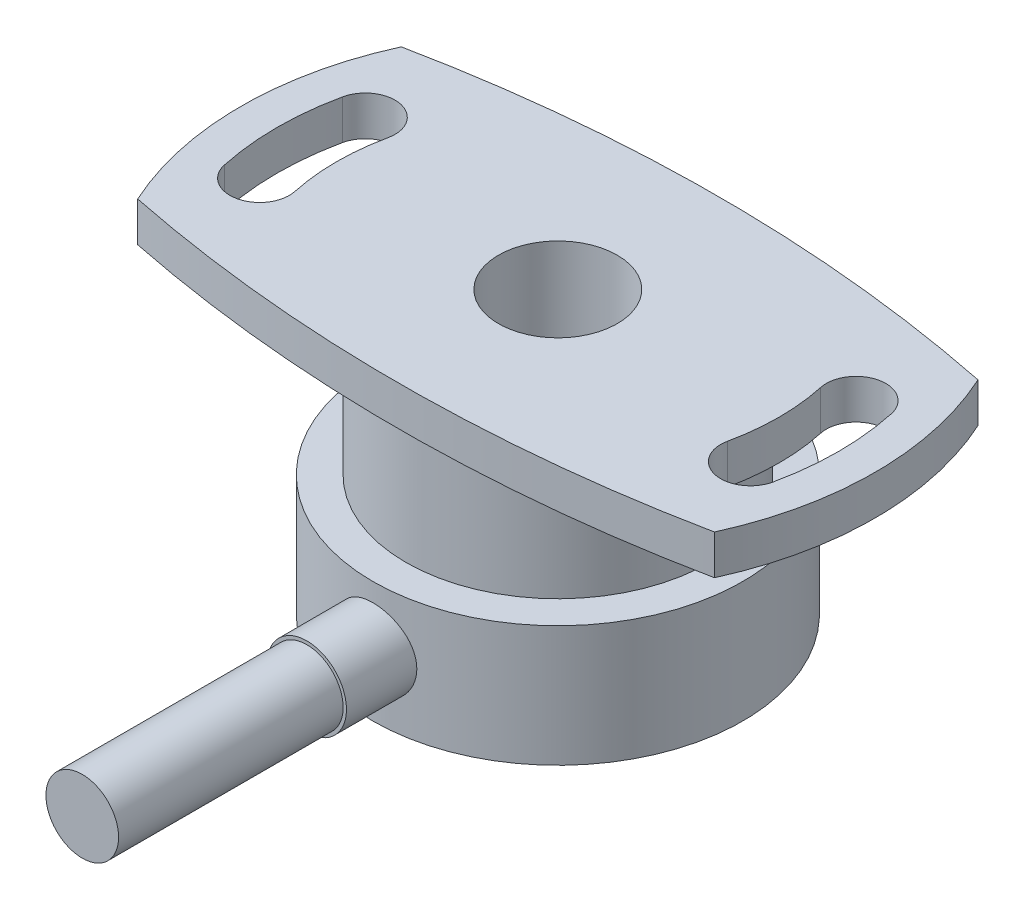
ISO-10303-21;
HEADER;
FILE_DESCRIPTION(('STEP AP214'),'2;1');
FILE_NAME('part.step','',(''),(''),'','','');
FILE_SCHEMA(('AUTOMOTIVE_DESIGN { 1 0 10303 214 1 1 1 1 }'));
ENDSEC;
DATA;
#1=APPLICATION_CONTEXT('core data for automotive mechanical design processes');
#2=APPLICATION_PROTOCOL_DEFINITION('international standard','automotive_design',2000,#1);
#3=PRODUCT_CONTEXT('',#1,'mechanical');
#4=PRODUCT('Part','Part','',(#3));
#5=PRODUCT_RELATED_PRODUCT_CATEGORY('part','',(#4));
#6=PRODUCT_DEFINITION_FORMATION('','',#4);
#7=PRODUCT_DEFINITION_CONTEXT('part definition',#1,'design');
#8=PRODUCT_DEFINITION('design','',#6,#7);
#9=PRODUCT_DEFINITION_SHAPE('','',#8);
#10=(LENGTH_UNIT() NAMED_UNIT(*) SI_UNIT(.MILLI.,.METRE.));
#11=(NAMED_UNIT(*) PLANE_ANGLE_UNIT() SI_UNIT($,.RADIAN.));
#12=(NAMED_UNIT(*) SI_UNIT($,.STERADIAN.) SOLID_ANGLE_UNIT());
#13=UNCERTAINTY_MEASURE_WITH_UNIT(LENGTH_MEASURE(1.E-05),#10,'distance_accuracy_value','');
#14=(GEOMETRIC_REPRESENTATION_CONTEXT(3) GLOBAL_UNCERTAINTY_ASSIGNED_CONTEXT((#13)) GLOBAL_UNIT_ASSIGNED_CONTEXT((#10,
#11,#12)) REPRESENTATION_CONTEXT('',''));
#15=CARTESIAN_POINT('',(0.,0.,0.));
#16=DIRECTION('',(0.,0.,1.));
#17=DIRECTION('',(1.,0.,0.));
#18=AXIS2_PLACEMENT_3D('',#15,#16,#17);
#19=CARTESIAN_POINT('',(0.,9.15,0.));
#20=DIRECTION('',(0.,-1.,0.));
#21=DIRECTION('',(0.,0.,-1.));
#22=AXIS2_PLACEMENT_3D('',#19,#20,#21);
#23=CYLINDRICAL_SURFACE('',#22,14.);
#24=CARTESIAN_POINT('',(0.,9.15,0.));
#25=DIRECTION('',(0.,1.,0.));
#26=DIRECTION('',(0.,0.,1.));
#27=AXIS2_PLACEMENT_3D('',#24,#25,#26);
#28=CIRCLE('',#27,14.);
#29=CARTESIAN_POINT('',(0.,9.15,14.));
#30=VERTEX_POINT('',#29);
#31=EDGE_CURVE('E255',#30,#30,#28,.T.);
#32=ORIENTED_EDGE('',*,*,#31,.F.);
#33=EDGE_LOOP('',(#32));
#34=FACE_BOUND('',#33,.T.);
#35=CARTESIAN_POINT('',(0.,0.,0.));
#36=DIRECTION('',(0.,1.,0.));
#37=DIRECTION('',(0.,0.,1.));
#38=AXIS2_PLACEMENT_3D('',#35,#36,#37);
#39=CIRCLE('',#38,14.);
#40=CARTESIAN_POINT('',(0.,0.,14.));
#41=VERTEX_POINT('',#40);
#42=EDGE_CURVE('E249',#41,#41,#39,.T.);
#43=ORIENTED_EDGE('',*,*,#42,.T.);
#44=EDGE_LOOP('',(#43));
#45=FACE_BOUND('',#44,.T.);
#46=CARTESIAN_POINT('',(-3.,4.7624839188906,13.6747943311773));
#47=CARTESIAN_POINT('',(-2.99999416477353,4.59606161392458,13.6747976912119));
#48=CARTESIAN_POINT('',(-2.9861047248957,4.42956837100579,13.6778654468474));
#49=CARTESIAN_POINT('',(-2.93097118505965,4.10131057440716,13.6897835685885));
#50=CARTESIAN_POINT('',(-2.88970679307234,3.93954962153835,13.6986382242345));
#51=CARTESIAN_POINT('',(-2.78117727369208,3.62555241974204,13.7210823058705));
#52=CARTESIAN_POINT('',(-2.71394001982631,3.47330616264763,13.7346666545171));
#53=CARTESIAN_POINT('',(-2.55545235346679,3.18225337100143,13.7650334169723));
#54=CARTESIAN_POINT('',(-2.46420264097551,3.04344644483246,13.7818157375507));
#55=CARTESIAN_POINT('',(-2.25870285140442,2.78095799592635,13.8169915759332));
#56=CARTESIAN_POINT('',(-2.14413718967966,2.65752616641068,13.8354049974351));
#57=CARTESIAN_POINT('',(-1.89593901625915,2.43147681007904,13.8715938342079));
#58=CARTESIAN_POINT('',(-1.76230506043535,2.32886086117047,13.8893692010283));
#59=CARTESIAN_POINT('',(-1.47809457692916,2.14637302990774,13.9224953821886));
#60=CARTESIAN_POINT('',(-1.32736097645991,2.06674060734937,13.9378199763886));
#61=CARTESIAN_POINT('',(-1.01426853868519,1.93402853599802,13.9640934208587));
#62=CARTESIAN_POINT('',(-0.851910954760624,1.88094602931804,13.9750427420666));
#63=CARTESIAN_POINT('',(-0.522774375343024,1.80362397702792,13.9911913056236));
#64=CARTESIAN_POINT('',(-0.356098801193847,1.77896206178575,13.9964746675677));
#65=CARTESIAN_POINT('',(-0.0208978906132898,1.75786136426409,14.00098724414));
#66=CARTESIAN_POINT('',(0.147627240329518,1.76141947776909,14.000217124654));
#67=CARTESIAN_POINT('',(0.478834058501024,1.79634184821777,13.9927740172512));
#68=CARTESIAN_POINT('',(0.641566230724225,1.82725091947045,13.9861976630486));
#69=CARTESIAN_POINT('',(0.959478927956778,1.91527328259433,13.9679908317821));
#70=CARTESIAN_POINT('',(1.11465912035011,1.97238772749009,13.9563601323304));
#71=CARTESIAN_POINT('',(1.41433499511311,2.11160683666764,13.9291950929372));
#72=CARTESIAN_POINT('',(1.55874731403158,2.1938854532993,13.9136337160789));
#73=CARTESIAN_POINT('',(1.83188185312569,2.3809678552178,13.8803158748773));
#74=CARTESIAN_POINT('',(1.96060201290306,2.48577459349121,13.8625591228939));
#75=CARTESIAN_POINT('',(2.20140417600396,2.71742100794633,13.8263865292185));
#76=CARTESIAN_POINT('',(2.31310234640501,2.84465907760467,13.8079646074571));
#77=CARTESIAN_POINT('',(2.51364486469456,3.11625048902762,13.7728713366395));
#78=CARTESIAN_POINT('',(2.60248864236137,3.2606042577011,13.7562000312677));
#79=CARTESIAN_POINT('',(2.75496155146593,3.56293292101812,13.7264804717345));
#80=CARTESIAN_POINT('',(2.81852070177845,3.72094416659548,13.7134423025555));
#81=CARTESIAN_POINT('',(2.91806990318231,4.04574945078348,13.6926068161323));
#82=CARTESIAN_POINT('',(2.95406413389256,4.21254215377699,13.6848087043697));
#83=CARTESIAN_POINT('',(2.99687172049304,4.54667542419003,13.6754976251089));
#84=CARTESIAN_POINT('',(3.0042428385728,4.71394126904521,13.673864541034));
#85=CARTESIAN_POINT('',(2.99110279284747,5.04731190525399,13.6767447914799));
#86=CARTESIAN_POINT('',(2.9705934616327,5.2134167721977,13.6812577220213));
#87=CARTESIAN_POINT('',(2.90275789271168,5.53782478885213,13.6958083096841));
#88=CARTESIAN_POINT('',(2.85573660503107,5.69619478408452,13.7057831054873));
#89=CARTESIAN_POINT('',(2.73654105893499,6.00280859395645,13.7300771973955));
#90=CARTESIAN_POINT('',(2.66436447325636,6.15105147015899,13.744396895457));
#91=CARTESIAN_POINT('',(2.4956700883341,6.43562328840844,13.7760326816069));
#92=CARTESIAN_POINT('',(2.39880737181584,6.57174308291497,13.7933900349263));
#93=CARTESIAN_POINT('',(2.18394367667201,6.82600061063819,13.8290355072028));
#94=CARTESIAN_POINT('',(2.06594018364322,6.94413620178754,13.8473237366892));
#95=CARTESIAN_POINT('',(1.80962552884163,7.16122452478012,13.8831647998035));
#96=CARTESIAN_POINT('',(1.67098985165754,7.25979775120463,13.9006987121549));
#97=CARTESIAN_POINT('',(1.37880296256455,7.4322547375927,13.932712214298));
#98=CARTESIAN_POINT('',(1.22525243208748,7.50613962483627,13.9471919435339));
#99=CARTESIAN_POINT('',(0.90853083796408,7.62658802816756,13.9713855676315));
#100=CARTESIAN_POINT('',(0.745426386150346,7.67332052638316,13.9811288760739));
#101=CARTESIAN_POINT('',(0.413450354006576,7.73866733035524,13.9948787860397));
#102=CARTESIAN_POINT('',(0.244579579947977,7.75728555083841,13.9988861862461));
#103=CARTESIAN_POINT('',(-0.0905274341056518,7.76570522371433,14.000690220181));
#104=CARTESIAN_POINT('',(-0.256749011018432,7.7560742360999,13.9986091800327));
#105=CARTESIAN_POINT('',(-0.585145876831951,7.70953439185249,13.9887310472683));
#106=CARTESIAN_POINT('',(-0.747321232810677,7.67262598773378,13.9809340494761));
#107=CARTESIAN_POINT('',(-1.06260389697444,7.57284630639181,13.9605077727683));
#108=CARTESIAN_POINT('',(-1.21573673014596,7.51005254012018,13.9478929286009));
#109=CARTESIAN_POINT('',(-1.50936991344683,7.36036137655168,13.9191807210221));
#110=CARTESIAN_POINT('',(-1.64986908959375,7.27346174227599,13.9030830344402));
#111=CARTESIAN_POINT('',(-1.91702461378899,7.07615928140786,13.8687961986559));
#112=CARTESIAN_POINT('',(-2.04338073020593,6.96535560225777,13.8505741780296));
#113=CARTESIAN_POINT('',(-2.27590002915847,6.72420269838012,13.8142738016446));
#114=CARTESIAN_POINT('',(-2.38205836126942,6.59384879214282,13.7961954813912));
#115=CARTESIAN_POINT('',(-2.57246523191562,6.31530293255136,13.761973872554));
#116=CARTESIAN_POINT('',(-2.65641795611844,6.16690520244516,13.7458581173137));
#117=CARTESIAN_POINT('',(-2.79806009312271,5.85779647717377,13.7177299427787));
#118=CARTESIAN_POINT('',(-2.8557721284606,5.69709622841875,13.7057139912142));
#119=CARTESIAN_POINT('',(-2.93277214244341,5.40723165649826,13.6894112131582));
#120=CARTESIAN_POINT('',(-2.95793505015818,5.27966056746938,13.683965661845));
#121=CARTESIAN_POINT('',(-2.99155088086543,5.02223529574153,13.6766559900021));
#122=CARTESIAN_POINT('',(-3.00000455455863,4.89238121587563,13.6747917085757));
#123=CARTESIAN_POINT('',(-3.,4.7624839188906,13.6747943311773));
#124=B_SPLINE_CURVE_WITH_KNOTS('',3,(#46,#47,#48,#49,#50,#51,#52,#53,#54,#55,#56,#57,#58,#59,
#60,#61,#62,#63,#64,#65,#66,#67,#68,#69,#70,#71,#72,#73,#74,#75,#76,#77,#78,#79,#80,#81,#82,#83,
#84,#85,#86,#87,#88,#89,#90,#91,#92,#93,#94,#95,#96,#97,#98,#99,#100,#101,#102,#103,#104,#105,
#106,#107,#108,#109,#110,#111,#112,#113,#114,#115,#116,#117,#118,#119,#120,#121,#122,#123),
.UNSPECIFIED.,.T.,.F.,(4,2,2,2,2,2,2,2,2,2,2,2,2,2,2,2,2,2,2,2,2,2,2,2,2,2,2,2,2,2,2,2,2,2,2,2,
2,2,4),(0.,0.498790964055055,0.997952076959927,1.49657898230552,1.99519135347056,
2.50106459165384,3.00697616225757,3.51798269640556,4.02893421292535,4.53219016303857,
5.03539075554482,5.53037115334743,6.02537333215167,6.52387776286874,7.02244757744629,
7.53097921558589,8.03952354046184,8.54946574823562,9.05933061907677,9.55920866385045,
10.0590538530783,10.5532636149875,11.047519111263,11.5491002043264,12.0507409931816,
12.5613242936642,13.0718842775108,13.5792317964875,14.0865086641708,14.5836639928825,
15.080811074302,15.5764801923897,16.0721953230273,16.5769782832193,17.0818823126246,
17.593207603363,18.1040912322742,18.4934291224859,18.8827495204009),.UNSPECIFIED.);
#125=CARTESIAN_POINT('',(-3.,4.7624839188906,13.6747943311773));
#126=VERTEX_POINT('',#125);
#127=EDGE_CURVE('E50',#126,#126,#124,.T.);
#128=ORIENTED_EDGE('',*,*,#127,.F.);
#129=EDGE_LOOP('',(#128));
#130=FACE_BOUND('',#129,.T.);
#131=ADVANCED_FACE('F46',(#34,#45,#130),#23,.T.);
#132=CARTESIAN_POINT('',(0.,21.3,0.));
#133=DIRECTION('',(0.,1.,0.));
#134=DIRECTION('',(0.,0.,1.));
#135=AXIS2_PLACEMENT_3D('',#132,#133,#134);
#136=PLANE('',#135);
#137=CARTESIAN_POINT('',(0.,21.3,0.));
#138=DIRECTION('',(0.,-1.,0.));
#139=DIRECTION('',(0.,0.,-1.));
#140=AXIS2_PLACEMENT_3D('',#137,#138,#139);
#141=CIRCLE('',#140,4.495);
#142=CARTESIAN_POINT('',(0.,21.3,-4.495));
#143=VERTEX_POINT('',#142);
#144=EDGE_CURVE('E390',#143,#143,#141,.T.);
#145=ORIENTED_EDGE('',*,*,#144,.T.);
#146=EDGE_LOOP('',(#145));
#147=FACE_BOUND('',#146,.T.);
#148=CARTESIAN_POINT('',(-18.5743988175311,21.3,-3.99896343660469));
#149=DIRECTION('',(0.,1.,0.));
#150=DIRECTION('',(0.,0.,1.));
#151=AXIS2_PLACEMENT_3D('',#148,#149,#150);
#152=CIRCLE('',#151,2.25);
#153=CARTESIAN_POINT('',(-16.3747989575603,21.3,-3.52540197700677));
#154=VERTEX_POINT('',#153);
#155=CARTESIAN_POINT('',(-20.7739986775018,21.3,-4.47252489620261));
#156=VERTEX_POINT('',#155);
#157=EDGE_CURVE('E171',#154,#156,#152,.T.);
#158=ORIENTED_EDGE('',*,*,#157,.F.);
#159=CARTESIAN_POINT('',(2.15105711021124E-13,21.3,0.));
#160=DIRECTION('',(0.,-1.,0.));
#161=DIRECTION('',(0.,0.,1.));
#162=AXIS2_PLACEMENT_3D('',#159,#160,#161);
#163=CIRCLE('',#162,16.7500000000002);
#164=CARTESIAN_POINT('',(-16.3747989575603,21.3,3.52540197700677));
#165=VERTEX_POINT('',#164);
#166=EDGE_CURVE('E186',#165,#154,#163,.T.);
#167=ORIENTED_EDGE('',*,*,#166,.F.);
#168=CARTESIAN_POINT('',(-18.5743988175311,21.3,3.99896343660469));
#169=DIRECTION('',(0.,1.,0.));
#170=DIRECTION('',(0.,0.,1.));
#171=AXIS2_PLACEMENT_3D('',#168,#169,#170);
#172=CIRCLE('',#171,2.25);
#173=CARTESIAN_POINT('',(-20.7739986775018,21.3,4.47252489620261));
#174=VERTEX_POINT('',#173);
#175=EDGE_CURVE('E182',#174,#165,#172,.T.);
#176=ORIENTED_EDGE('',*,*,#175,.F.);
#177=CARTESIAN_POINT('',(2.15105711021124E-13,21.3,0.));
#178=DIRECTION('',(0.,1.,0.));
#179=DIRECTION('',(0.,0.,1.));
#180=AXIS2_PLACEMENT_3D('',#177,#178,#179);
#181=CIRCLE('',#180,21.2500000000002);
#182=EDGE_CURVE('E178',#156,#174,#181,.T.);
#183=ORIENTED_EDGE('',*,*,#182,.F.);
#184=EDGE_LOOP('',(#158,#167,#176,#183));
#185=FACE_BOUND('',#184,.T.);
#186=CARTESIAN_POINT('',(0.,21.3,0.));
#187=DIRECTION('',(0.,1.,0.));
#188=DIRECTION('',(0.,0.,1.));
#189=AXIS2_PLACEMENT_3D('',#186,#187,#188);
#190=CIRCLE('',#189,24.);
#191=CARTESIAN_POINT('',(21.8286551202116,21.3,9.97546067321504));
#192=VERTEX_POINT('',#191);
#193=CARTESIAN_POINT('',(21.8286551202116,21.3,-9.97546067321505));
#194=VERTEX_POINT('',#193);
#195=EDGE_CURVE('E234',#192,#194,#190,.T.);
#196=ORIENTED_EDGE('',*,*,#195,.T.);
#197=CARTESIAN_POINT('',(0.,21.3,97.4322675051198));
#198=DIRECTION('',(0.,-1.,0.));
#199=DIRECTION('',(0.,0.,-1.));
#200=AXIS2_PLACEMENT_3D('',#197,#198,#199);
#201=CIRCLE('',#200,109.603422650884);
#202=CARTESIAN_POINT('',(-21.8286551202116,21.3,-9.97546067321506));
#203=VERTEX_POINT('',#202);
#204=EDGE_CURVE('E216',#203,#194,#201,.T.);
#205=ORIENTED_EDGE('',*,*,#204,.F.);
#206=CARTESIAN_POINT('',(0.,21.3,0.));
#207=DIRECTION('',(0.,1.,0.));
#208=DIRECTION('',(0.,0.,1.));
#209=AXIS2_PLACEMENT_3D('',#206,#207,#208);
#210=CIRCLE('',#209,24.);
#211=CARTESIAN_POINT('',(-21.8286551202116,21.3,9.97546067321505));
#212=VERTEX_POINT('',#211);
#213=EDGE_CURVE('E230',#203,#212,#210,.T.);
#214=ORIENTED_EDGE('',*,*,#213,.T.);
#215=CARTESIAN_POINT('',(0.,21.3,-97.4322675051244));
#216=DIRECTION('',(0.,-1.,0.));
#217=DIRECTION('',(0.,0.,1.));
#218=AXIS2_PLACEMENT_3D('',#215,#216,#217);
#219=CIRCLE('',#218,109.603422650888);
#220=EDGE_CURVE('E219',#192,#212,#219,.T.);
#221=ORIENTED_EDGE('',*,*,#220,.F.);
#222=EDGE_LOOP('',(#196,#205,#214,#221));
#223=FACE_BOUND('',#222,.T.);
#224=CARTESIAN_POINT('',(-2.15105711021124E-13,21.3,0.));
#225=DIRECTION('',(0.,1.,0.));
#226=DIRECTION('',(0.,0.,1.));
#227=AXIS2_PLACEMENT_3D('',#224,#225,#226);
#228=CIRCLE('',#227,16.7500000000002);
#229=CARTESIAN_POINT('',(16.3747989575603,21.3,3.52540197700677));
#230=VERTEX_POINT('',#229);
#231=CARTESIAN_POINT('',(16.3747989575603,21.3,-3.52540197700677));
#232=VERTEX_POINT('',#231);
#233=EDGE_CURVE('E154',#230,#232,#228,.T.);
#234=ORIENTED_EDGE('',*,*,#233,.T.);
#235=CARTESIAN_POINT('',(18.5743988175311,21.3,-3.99896343660469));
#236=DIRECTION('',(0.,-1.,0.));
#237=DIRECTION('',(0.,0.,1.));
#238=AXIS2_PLACEMENT_3D('',#235,#236,#237);
#239=CIRCLE('',#238,2.25);
#240=CARTESIAN_POINT('',(20.7739986775018,21.3,-4.47252489620261));
#241=VERTEX_POINT('',#240);
#242=EDGE_CURVE('E67',#232,#241,#239,.T.);
#243=ORIENTED_EDGE('',*,*,#242,.T.);
#244=CARTESIAN_POINT('',(-2.15105711021124E-13,21.3,0.));
#245=DIRECTION('',(0.,-1.,0.));
#246=DIRECTION('',(0.,0.,1.));
#247=AXIS2_PLACEMENT_3D('',#244,#245,#246);
#248=CIRCLE('',#247,21.2500000000002);
#249=CARTESIAN_POINT('',(20.7739986775018,21.3,4.47252489620261));
#250=VERTEX_POINT('',#249);
#251=EDGE_CURVE('E161',#241,#250,#248,.T.);
#252=ORIENTED_EDGE('',*,*,#251,.T.);
#253=CARTESIAN_POINT('',(18.5743988175311,21.3,3.99896343660469));
#254=DIRECTION('',(0.,-1.,0.));
#255=DIRECTION('',(0.,0.,1.));
#256=AXIS2_PLACEMENT_3D('',#253,#254,#255);
#257=CIRCLE('',#256,2.25);
#258=EDGE_CURVE('E144',#250,#230,#257,.T.);
#259=ORIENTED_EDGE('',*,*,#258,.T.);
#260=EDGE_LOOP('',(#234,#243,#252,#259));
#261=FACE_BOUND('',#260,.T.);
#262=ADVANCED_FACE('F159',(#147,#185,#223,#261),#136,.T.);
#263=CARTESIAN_POINT('',(0.,18.3,0.));
#264=DIRECTION('',(0.,1.,0.));
#265=DIRECTION('',(0.,0.,1.));
#266=AXIS2_PLACEMENT_3D('',#263,#264,#265);
#267=PLANE('',#266);
#268=CARTESIAN_POINT('',(0.,18.3,97.4322675051198));
#269=DIRECTION('',(0.,1.,0.));
#270=DIRECTION('',(0.,0.,1.));
#271=AXIS2_PLACEMENT_3D('',#268,#269,#270);
#272=CIRCLE('',#271,109.603422650884);
#273=CARTESIAN_POINT('',(21.8286551202116,18.3,-9.97546067321504));
#274=VERTEX_POINT('',#273);
#275=CARTESIAN_POINT('',(-21.8286551202116,18.3,-9.97546067321505));
#276=VERTEX_POINT('',#275);
#277=EDGE_CURVE('E215',#274,#276,#272,.T.);
#278=ORIENTED_EDGE('',*,*,#277,.F.);
#279=CARTESIAN_POINT('',(0.,18.3,0.));
#280=DIRECTION('',(0.,1.,0.));
#281=DIRECTION('',(0.,0.,1.));
#282=AXIS2_PLACEMENT_3D('',#279,#280,#281);
#283=CIRCLE('',#282,24.);
#284=CARTESIAN_POINT('',(21.8286551202116,18.3,9.97546067321504));
#285=VERTEX_POINT('',#284);
#286=EDGE_CURVE('E235',#285,#274,#283,.T.);
#287=ORIENTED_EDGE('',*,*,#286,.F.);
#288=CARTESIAN_POINT('',(0.,18.3,-97.4322675051244));
#289=DIRECTION('',(0.,1.,0.));
#290=DIRECTION('',(0.,0.,1.));
#291=AXIS2_PLACEMENT_3D('',#288,#289,#290);
#292=CIRCLE('',#291,109.603422650888);
#293=CARTESIAN_POINT('',(-21.8286551202116,18.3,9.97546067321506));
#294=VERTEX_POINT('',#293);
#295=EDGE_CURVE('E225',#294,#285,#292,.T.);
#296=ORIENTED_EDGE('',*,*,#295,.F.);
#297=CARTESIAN_POINT('',(0.,18.3,0.));
#298=DIRECTION('',(0.,1.,0.));
#299=DIRECTION('',(0.,0.,1.));
#300=AXIS2_PLACEMENT_3D('',#297,#298,#299);
#301=CIRCLE('',#300,24.);
#302=EDGE_CURVE('E222',#276,#294,#301,.T.);
#303=ORIENTED_EDGE('',*,*,#302,.F.);
#304=EDGE_LOOP('',(#278,#287,#296,#303));
#305=FACE_BOUND('',#304,.T.);
#306=CARTESIAN_POINT('',(0.,18.3,0.));
#307=DIRECTION('',(0.,1.,0.));
#308=DIRECTION('',(0.,0.,1.));
#309=AXIS2_PLACEMENT_3D('',#306,#307,#308);
#310=CIRCLE('',#309,11.5);
#311=CARTESIAN_POINT('',(0.,18.3,11.5));
#312=VERTEX_POINT('',#311);
#313=EDGE_CURVE('E239',#312,#312,#310,.T.);
#314=ORIENTED_EDGE('',*,*,#313,.T.);
#315=EDGE_LOOP('',(#314));
#316=FACE_BOUND('',#315,.T.);
#317=CARTESIAN_POINT('',(2.15105711021124E-13,18.3,0.));
#318=DIRECTION('',(0.,1.,0.));
#319=DIRECTION('',(0.,0.,1.));
#320=AXIS2_PLACEMENT_3D('',#317,#318,#319);
#321=CIRCLE('',#320,16.7500000000002);
#322=CARTESIAN_POINT('',(-16.3747989575603,18.3,3.52540197700677));
#323=VERTEX_POINT('',#322);
#324=CARTESIAN_POINT('',(-16.3747989575603,18.3,-3.52540197700677));
#325=VERTEX_POINT('',#324);
#326=EDGE_CURVE('E269',#323,#325,#321,.F.);
#327=ORIENTED_EDGE('',*,*,#326,.T.);
#328=CARTESIAN_POINT('',(-18.5743988175311,18.3,-3.99896343660469));
#329=DIRECTION('',(0.,1.,0.));
#330=DIRECTION('',(0.,0.,1.));
#331=AXIS2_PLACEMENT_3D('',#328,#329,#330);
#332=CIRCLE('',#331,2.25);
#333=CARTESIAN_POINT('',(-20.7739986775018,18.3,-4.47252489620261));
#334=VERTEX_POINT('',#333);
#335=EDGE_CURVE('E273',#325,#334,#332,.T.);
#336=ORIENTED_EDGE('',*,*,#335,.T.);
#337=CARTESIAN_POINT('',(2.15105711021124E-13,18.3,0.));
#338=DIRECTION('',(0.,1.,0.));
#339=DIRECTION('',(0.,0.,1.));
#340=AXIS2_PLACEMENT_3D('',#337,#338,#339);
#341=CIRCLE('',#340,21.2500000000002);
#342=CARTESIAN_POINT('',(-20.7739986775018,18.3,4.47252489620261));
#343=VERTEX_POINT('',#342);
#344=EDGE_CURVE('E254',#334,#343,#341,.T.);
#345=ORIENTED_EDGE('',*,*,#344,.T.);
#346=CARTESIAN_POINT('',(-18.5743988175311,18.3,3.99896343660469));
#347=DIRECTION('',(0.,1.,0.));
#348=DIRECTION('',(0.,0.,1.));
#349=AXIS2_PLACEMENT_3D('',#346,#347,#348);
#350=CIRCLE('',#349,2.25);
#351=EDGE_CURVE('E265',#343,#323,#350,.T.);
#352=ORIENTED_EDGE('',*,*,#351,.T.);
#353=EDGE_LOOP('',(#327,#336,#345,#352));
#354=FACE_BOUND('',#353,.T.);
#355=CARTESIAN_POINT('',(18.5743988175311,18.3,-3.99896343660469));
#356=DIRECTION('',(0.,1.,0.));
#357=DIRECTION('',(0.,0.,1.));
#358=AXIS2_PLACEMENT_3D('',#355,#356,#357);
#359=CIRCLE('',#358,2.25);
#360=CARTESIAN_POINT('',(16.3747989575603,18.3,-3.52540197700677));
#361=VERTEX_POINT('',#360);
#362=CARTESIAN_POINT('',(20.7739986775018,18.3,-4.47252489620261));
#363=VERTEX_POINT('',#362);
#364=EDGE_CURVE('E284',#361,#363,#359,.F.);
#365=ORIENTED_EDGE('',*,*,#364,.F.);
#366=CARTESIAN_POINT('',(-2.15105711021124E-13,18.3,0.));
#367=DIRECTION('',(0.,1.,0.));
#368=DIRECTION('',(0.,0.,1.));
#369=AXIS2_PLACEMENT_3D('',#366,#367,#368);
#370=CIRCLE('',#369,16.7500000000002);
#371=CARTESIAN_POINT('',(16.3747989575603,18.3,3.52540197700677));
#372=VERTEX_POINT('',#371);
#373=EDGE_CURVE('E277',#372,#361,#370,.T.);
#374=ORIENTED_EDGE('',*,*,#373,.F.);
#375=CARTESIAN_POINT('',(18.5743988175311,18.3,3.99896343660469));
#376=DIRECTION('',(0.,1.,0.));
#377=DIRECTION('',(0.,0.,1.));
#378=AXIS2_PLACEMENT_3D('',#375,#376,#377);
#379=CIRCLE('',#378,2.25);
#380=CARTESIAN_POINT('',(20.7739986775018,18.3,4.47252489620261));
#381=VERTEX_POINT('',#380);
#382=EDGE_CURVE('E147',#381,#372,#379,.F.);
#383=ORIENTED_EDGE('',*,*,#382,.F.);
#384=CARTESIAN_POINT('',(-2.15105711021124E-13,18.3,0.));
#385=DIRECTION('',(0.,1.,0.));
#386=DIRECTION('',(0.,0.,1.));
#387=AXIS2_PLACEMENT_3D('',#384,#385,#386);
#388=CIRCLE('',#387,21.2500000000002);
#389=EDGE_CURVE('E282',#363,#381,#388,.F.);
#390=ORIENTED_EDGE('',*,*,#389,.F.);
#391=EDGE_LOOP('',(#365,#374,#383,#390));
#392=FACE_BOUND('',#391,.T.);
#393=ADVANCED_FACE('F301',(#305,#316,#354,#392),#267,.F.);
#394=CARTESIAN_POINT('',(0.,9.15,0.));
#395=DIRECTION('',(0.,1.,0.));
#396=DIRECTION('',(0.,0.,1.));
#397=AXIS2_PLACEMENT_3D('',#394,#395,#396);
#398=PLANE('',#397);
#399=CARTESIAN_POINT('',(0.,9.15,0.));
#400=DIRECTION('',(0.,1.,0.));
#401=DIRECTION('',(0.,0.,1.));
#402=AXIS2_PLACEMENT_3D('',#399,#400,#401);
#403=CIRCLE('',#402,11.5);
#404=CARTESIAN_POINT('',(0.,9.15,11.5));
#405=VERTEX_POINT('',#404);
#406=EDGE_CURVE('E250',#405,#405,#403,.T.);
#407=ORIENTED_EDGE('',*,*,#406,.F.);
#408=EDGE_LOOP('',(#407));
#409=FACE_BOUND('',#408,.T.);
#410=ORIENTED_EDGE('',*,*,#31,.T.);
#411=EDGE_LOOP('',(#410));
#412=FACE_BOUND('',#411,.T.);
#413=ADVANCED_FACE('F311',(#409,#412),#398,.T.);
#414=CARTESIAN_POINT('',(0.,0.,0.));
#415=DIRECTION('',(0.,1.,0.));
#416=DIRECTION('',(0.,0.,1.));
#417=AXIS2_PLACEMENT_3D('',#414,#415,#416);
#418=PLANE('',#417);
#419=CARTESIAN_POINT('',(0.,0.,0.));
#420=DIRECTION('',(0.,-1.,0.));
#421=DIRECTION('',(0.,0.,-1.));
#422=AXIS2_PLACEMENT_3D('',#419,#420,#421);
#423=CIRCLE('',#422,4.495);
#424=CARTESIAN_POINT('',(0.,0.,-4.495));
#425=VERTEX_POINT('',#424);
#426=EDGE_CURVE('E392',#425,#425,#423,.T.);
#427=ORIENTED_EDGE('',*,*,#426,.F.);
#428=EDGE_LOOP('',(#427));
#429=FACE_BOUND('',#428,.T.);
#430=ORIENTED_EDGE('',*,*,#42,.F.);
#431=EDGE_LOOP('',(#430));
#432=FACE_BOUND('',#431,.T.);
#433=ADVANCED_FACE('F308',(#429,#432),#418,.F.);
#434=CARTESIAN_POINT('',(0.,18.3,0.));
#435=DIRECTION('',(0.,-1.,0.));
#436=DIRECTION('',(0.,0.,-1.));
#437=AXIS2_PLACEMENT_3D('',#434,#435,#436);
#438=CYLINDRICAL_SURFACE('',#437,11.5);
#439=ORIENTED_EDGE('',*,*,#313,.F.);
#440=EDGE_LOOP('',(#439));
#441=FACE_BOUND('',#440,.T.);
#442=ORIENTED_EDGE('',*,*,#406,.T.);
#443=EDGE_LOOP('',(#442));
#444=FACE_BOUND('',#443,.T.);
#445=ADVANCED_FACE('F310',(#441,#444),#438,.T.);
#446=CARTESIAN_POINT('',(0.,21.3,0.));
#447=DIRECTION('',(0.,-1.,0.));
#448=DIRECTION('',(0.,0.,-1.));
#449=AXIS2_PLACEMENT_3D('',#446,#447,#448);
#450=CYLINDRICAL_SURFACE('',#449,24.);
#451=ORIENTED_EDGE('',*,*,#213,.F.);
#452=DIRECTION('',(0.,-1.,0.));
#453=VECTOR('',#452,1.);
#454=CARTESIAN_POINT('',(-21.8286551202116,21.3,-9.97546067321505));
#455=LINE('',#454,#453);
#456=EDGE_CURVE('E212',#276,#203,#455,.F.);
#457=ORIENTED_EDGE('',*,*,#456,.F.);
#458=ORIENTED_EDGE('',*,*,#302,.T.);
#459=DIRECTION('',(0.,-1.,0.));
#460=VECTOR('',#459,1.);
#461=CARTESIAN_POINT('',(-21.8286551202116,21.3,9.97546067321505));
#462=LINE('',#461,#460);
#463=EDGE_CURVE('E208',#212,#294,#462,.T.);
#464=ORIENTED_EDGE('',*,*,#463,.F.);
#465=EDGE_LOOP('',(#451,#457,#458,#464));
#466=FACE_BOUND('',#465,.T.);
#467=ADVANCED_FACE('F317',(#466),#450,.T.);
#468=CARTESIAN_POINT('',(0.,21.3,0.));
#469=DIRECTION('',(0.,-1.,0.));
#470=DIRECTION('',(0.,0.,-1.));
#471=AXIS2_PLACEMENT_3D('',#468,#469,#470);
#472=CYLINDRICAL_SURFACE('',#471,24.);
#473=ORIENTED_EDGE('',*,*,#286,.T.);
#474=DIRECTION('',(0.,-1.,0.));
#475=VECTOR('',#474,1.);
#476=CARTESIAN_POINT('',(21.8286551202116,21.3,-9.97546067321504));
#477=LINE('',#476,#475);
#478=EDGE_CURVE('E204',#194,#274,#477,.T.);
#479=ORIENTED_EDGE('',*,*,#478,.F.);
#480=ORIENTED_EDGE('',*,*,#195,.F.);
#481=DIRECTION('',(0.,-1.,0.));
#482=VECTOR('',#481,1.);
#483=CARTESIAN_POINT('',(21.8286551202116,21.3,9.97546067321504));
#484=LINE('',#483,#482);
#485=EDGE_CURVE('E194',#285,#192,#484,.F.);
#486=ORIENTED_EDGE('',*,*,#485,.F.);
#487=EDGE_LOOP('',(#473,#479,#480,#486));
#488=FACE_BOUND('',#487,.T.);
#489=ADVANCED_FACE('F327',(#488),#472,.T.);
#490=CARTESIAN_POINT('',(0.,-0.001000000000001,-97.4322675051244));
#491=DIRECTION('',(0.,1.,0.));
#492=DIRECTION('',(0.,0.,1.));
#493=AXIS2_PLACEMENT_3D('',#490,#491,#492);
#494=CYLINDRICAL_SURFACE('',#493,109.603422650888);
#495=ORIENTED_EDGE('',*,*,#295,.T.);
#496=ORIENTED_EDGE('',*,*,#485,.T.);
#497=ORIENTED_EDGE('',*,*,#220,.T.);
#498=ORIENTED_EDGE('',*,*,#463,.T.);
#499=EDGE_LOOP('',(#495,#496,#497,#498));
#500=FACE_BOUND('',#499,.T.);
#501=ADVANCED_FACE('F331',(#500),#494,.T.);
#502=CARTESIAN_POINT('',(0.,-0.001000000000001,97.4322675051198));
#503=DIRECTION('',(0.,1.,0.));
#504=DIRECTION('',(0.,0.,1.));
#505=AXIS2_PLACEMENT_3D('',#502,#503,#504);
#506=CYLINDRICAL_SURFACE('',#505,109.603422650884);
#507=ORIENTED_EDGE('',*,*,#277,.T.);
#508=ORIENTED_EDGE('',*,*,#456,.T.);
#509=ORIENTED_EDGE('',*,*,#204,.T.);
#510=ORIENTED_EDGE('',*,*,#478,.T.);
#511=EDGE_LOOP('',(#507,#508,#509,#510));
#512=FACE_BOUND('',#511,.T.);
#513=ADVANCED_FACE('F338',(#512),#506,.T.);
#514=CARTESIAN_POINT('',(-18.5743988175311,0.,-3.99896343660469));
#515=DIRECTION('',(0.,1.,0.));
#516=DIRECTION('',(0.,0.,1.));
#517=AXIS2_PLACEMENT_3D('',#514,#515,#516);
#518=CYLINDRICAL_SURFACE('',#517,2.25);
#519=DIRECTION('',(0.,1.,0.));
#520=VECTOR('',#519,1.);
#521=CARTESIAN_POINT('',(-16.3747989575603,0.,-3.52540197700677));
#522=LINE('',#521,#520);
#523=EDGE_CURVE('E191',#325,#154,#522,.T.);
#524=ORIENTED_EDGE('',*,*,#523,.T.);
#525=ORIENTED_EDGE('',*,*,#157,.T.);
#526=DIRECTION('',(0.,1.,0.));
#527=VECTOR('',#526,1.);
#528=CARTESIAN_POINT('',(-20.7739986775018,0.,-4.47252489620261));
#529=LINE('',#528,#527);
#530=EDGE_CURVE('E190',#334,#156,#529,.T.);
#531=ORIENTED_EDGE('',*,*,#530,.F.);
#532=ORIENTED_EDGE('',*,*,#335,.F.);
#533=EDGE_LOOP('',(#524,#525,#531,#532));
#534=FACE_BOUND('',#533,.T.);
#535=ADVANCED_FACE('F342',(#534),#518,.F.);
#536=CARTESIAN_POINT('',(2.15105711021124E-13,0.,0.));
#537=DIRECTION('',(0.,1.,0.));
#538=DIRECTION('',(0.,0.,1.));
#539=AXIS2_PLACEMENT_3D('',#536,#537,#538);
#540=CYLINDRICAL_SURFACE('',#539,16.7500000000002);
#541=DIRECTION('',(0.,1.,0.));
#542=VECTOR('',#541,1.);
#543=CARTESIAN_POINT('',(-16.3747989575603,0.,3.52540197700677));
#544=LINE('',#543,#542);
#545=EDGE_CURVE('E195',#323,#165,#544,.T.);
#546=ORIENTED_EDGE('',*,*,#545,.T.);
#547=ORIENTED_EDGE('',*,*,#166,.T.);
#548=ORIENTED_EDGE('',*,*,#523,.F.);
#549=ORIENTED_EDGE('',*,*,#326,.F.);
#550=EDGE_LOOP('',(#546,#547,#548,#549));
#551=FACE_BOUND('',#550,.T.);
#552=ADVANCED_FACE('F346',(#551),#540,.T.);
#553=CARTESIAN_POINT('',(-18.5743988175311,0.,3.99896343660469));
#554=DIRECTION('',(0.,1.,0.));
#555=DIRECTION('',(0.,0.,1.));
#556=AXIS2_PLACEMENT_3D('',#553,#554,#555);
#557=CYLINDRICAL_SURFACE('',#556,2.25);
#558=DIRECTION('',(0.,1.,0.));
#559=VECTOR('',#558,1.);
#560=CARTESIAN_POINT('',(-20.7739986775018,0.,4.47252489620261));
#561=LINE('',#560,#559);
#562=EDGE_CURVE('E198',#343,#174,#561,.T.);
#563=ORIENTED_EDGE('',*,*,#562,.T.);
#564=ORIENTED_EDGE('',*,*,#175,.T.);
#565=ORIENTED_EDGE('',*,*,#545,.F.);
#566=ORIENTED_EDGE('',*,*,#351,.F.);
#567=EDGE_LOOP('',(#563,#564,#565,#566));
#568=FACE_BOUND('',#567,.T.);
#569=ADVANCED_FACE('F352',(#568),#557,.F.);
#570=CARTESIAN_POINT('',(2.15105711021124E-13,0.,0.));
#571=DIRECTION('',(0.,1.,0.));
#572=DIRECTION('',(0.,0.,1.));
#573=AXIS2_PLACEMENT_3D('',#570,#571,#572);
#574=CYLINDRICAL_SURFACE('',#573,21.2500000000002);
#575=ORIENTED_EDGE('',*,*,#530,.T.);
#576=ORIENTED_EDGE('',*,*,#182,.T.);
#577=ORIENTED_EDGE('',*,*,#562,.F.);
#578=ORIENTED_EDGE('',*,*,#344,.F.);
#579=EDGE_LOOP('',(#575,#576,#577,#578));
#580=FACE_BOUND('',#579,.T.);
#581=ADVANCED_FACE('F348',(#580),#574,.F.);
#582=CARTESIAN_POINT('',(18.5743988175311,0.,-3.99896343660469));
#583=DIRECTION('',(0.,1.,0.));
#584=DIRECTION('',(0.,0.,1.));
#585=AXIS2_PLACEMENT_3D('',#582,#583,#584);
#586=CYLINDRICAL_SURFACE('',#585,2.25);
#587=ORIENTED_EDGE('',*,*,#364,.T.);
#588=DIRECTION('',(0.,1.,0.));
#589=VECTOR('',#588,1.);
#590=CARTESIAN_POINT('',(20.7739986775018,0.,-4.47252489620261));
#591=LINE('',#590,#589);
#592=EDGE_CURVE('E168',#363,#241,#591,.T.);
#593=ORIENTED_EDGE('',*,*,#592,.T.);
#594=ORIENTED_EDGE('',*,*,#242,.F.);
#595=DIRECTION('',(0.,1.,0.));
#596=VECTOR('',#595,1.);
#597=CARTESIAN_POINT('',(16.3747989575603,0.,-3.52540197700677));
#598=LINE('',#597,#596);
#599=EDGE_CURVE('E151',#361,#232,#598,.T.);
#600=ORIENTED_EDGE('',*,*,#599,.F.);
#601=EDGE_LOOP('',(#587,#593,#594,#600));
#602=FACE_BOUND('',#601,.T.);
#603=ADVANCED_FACE('F351',(#602),#586,.F.);
#604=CARTESIAN_POINT('',(-2.15105711021124E-13,0.,0.));
#605=DIRECTION('',(0.,1.,0.));
#606=DIRECTION('',(0.,0.,1.));
#607=AXIS2_PLACEMENT_3D('',#604,#605,#606);
#608=CYLINDRICAL_SURFACE('',#607,21.2500000000002);
#609=ORIENTED_EDGE('',*,*,#389,.T.);
#610=DIRECTION('',(0.,1.,0.));
#611=VECTOR('',#610,1.);
#612=CARTESIAN_POINT('',(20.7739986775018,0.,4.47252489620261));
#613=LINE('',#612,#611);
#614=EDGE_CURVE('E150',#381,#250,#613,.T.);
#615=ORIENTED_EDGE('',*,*,#614,.T.);
#616=ORIENTED_EDGE('',*,*,#251,.F.);
#617=ORIENTED_EDGE('',*,*,#592,.F.);
#618=EDGE_LOOP('',(#609,#615,#616,#617));
#619=FACE_BOUND('',#618,.T.);
#620=ADVANCED_FACE('F362',(#619),#608,.F.);
#621=CARTESIAN_POINT('',(18.5743988175311,0.,3.99896343660469));
#622=DIRECTION('',(0.,1.,0.));
#623=DIRECTION('',(0.,0.,1.));
#624=AXIS2_PLACEMENT_3D('',#621,#622,#623);
#625=CYLINDRICAL_SURFACE('',#624,2.25);
#626=ORIENTED_EDGE('',*,*,#382,.T.);
#627=DIRECTION('',(0.,1.,0.));
#628=VECTOR('',#627,1.);
#629=CARTESIAN_POINT('',(16.3747989575603,0.,3.52540197700677));
#630=LINE('',#629,#628);
#631=EDGE_CURVE('E75',#372,#230,#630,.T.);
#632=ORIENTED_EDGE('',*,*,#631,.T.);
#633=ORIENTED_EDGE('',*,*,#258,.F.);
#634=ORIENTED_EDGE('',*,*,#614,.F.);
#635=EDGE_LOOP('',(#626,#632,#633,#634));
#636=FACE_BOUND('',#635,.T.);
#637=ADVANCED_FACE('F141',(#636),#625,.F.);
#638=CARTESIAN_POINT('',(-2.15105711021124E-13,0.,0.));
#639=DIRECTION('',(0.,1.,0.));
#640=DIRECTION('',(0.,0.,1.));
#641=AXIS2_PLACEMENT_3D('',#638,#639,#640);
#642=CYLINDRICAL_SURFACE('',#641,16.7500000000002);
#643=ORIENTED_EDGE('',*,*,#373,.T.);
#644=ORIENTED_EDGE('',*,*,#599,.T.);
#645=ORIENTED_EDGE('',*,*,#233,.F.);
#646=ORIENTED_EDGE('',*,*,#631,.F.);
#647=EDGE_LOOP('',(#643,#644,#645,#646));
#648=FACE_BOUND('',#647,.T.);
#649=ADVANCED_FACE('F155',(#648),#642,.T.);
#650=CARTESIAN_POINT('',(0.,4.7624839188906,19.));
#651=DIRECTION('',(0.,0.,-1.));
#652=DIRECTION('',(-1.,0.,0.));
#653=AXIS2_PLACEMENT_3D('',#650,#651,#652);
#654=CYLINDRICAL_SURFACE('',#653,3.);
#655=CARTESIAN_POINT('',(0.,4.7624839188906,19.));
#656=DIRECTION('',(0.,0.,1.));
#657=DIRECTION('',(1.,0.,0.));
#658=AXIS2_PLACEMENT_3D('',#655,#656,#657);
#659=CIRCLE('',#658,3.);
#660=CARTESIAN_POINT('',(3.,4.7624839188906,19.));
#661=VERTEX_POINT('',#660);
#662=EDGE_CURVE('E401',#661,#661,#659,.T.);
#663=ORIENTED_EDGE('',*,*,#662,.F.);
#664=EDGE_LOOP('',(#663));
#665=FACE_BOUND('',#664,.T.);
#666=ORIENTED_EDGE('',*,*,#127,.T.);
#667=EDGE_LOOP('',(#666));
#668=FACE_BOUND('',#667,.T.);
#669=ADVANCED_FACE('F292',(#665,#668),#654,.T.);
#670=CARTESIAN_POINT('',(0.,4.7624839188906,19.));
#671=DIRECTION('',(0.,0.,1.));
#672=DIRECTION('',(1.,0.,0.));
#673=AXIS2_PLACEMENT_3D('',#670,#671,#672);
#674=PLANE('',#673);
#675=CARTESIAN_POINT('',(0.,4.7624839188906,19.));
#676=DIRECTION('',(0.,0.,1.));
#677=DIRECTION('',(1.,0.,0.));
#678=AXIS2_PLACEMENT_3D('',#675,#676,#677);
#679=CIRCLE('',#678,2.75);
#680=CARTESIAN_POINT('',(2.75,4.7624839188906,19.));
#681=VERTEX_POINT('',#680);
#682=EDGE_CURVE('E11',#681,#681,#679,.T.);
#683=ORIENTED_EDGE('',*,*,#682,.F.);
#684=EDGE_LOOP('',(#683));
#685=FACE_BOUND('',#684,.T.);
#686=ORIENTED_EDGE('',*,*,#662,.T.);
#687=EDGE_LOOP('',(#686));
#688=FACE_BOUND('',#687,.T.);
#689=ADVANCED_FACE('F370',(#685,#688),#674,.T.);
#690=CARTESIAN_POINT('',(0.,4.7624839188906,36.));
#691=DIRECTION('',(0.,0.,-1.));
#692=DIRECTION('',(-1.,0.,0.));
#693=AXIS2_PLACEMENT_3D('',#690,#691,#692);
#694=CYLINDRICAL_SURFACE('',#693,2.75);
#695=CARTESIAN_POINT('',(0.,4.7624839188906,36.));
#696=DIRECTION('',(0.,0.,1.));
#697=DIRECTION('',(1.,0.,0.));
#698=AXIS2_PLACEMENT_3D('',#695,#696,#697);
#699=CIRCLE('',#698,2.75);
#700=CARTESIAN_POINT('',(2.75,4.7624839188906,36.));
#701=VERTEX_POINT('',#700);
#702=EDGE_CURVE('E396',#701,#701,#699,.T.);
#703=ORIENTED_EDGE('',*,*,#702,.F.);
#704=EDGE_LOOP('',(#703));
#705=FACE_BOUND('',#704,.T.);
#706=ORIENTED_EDGE('',*,*,#682,.T.);
#707=EDGE_LOOP('',(#706));
#708=FACE_BOUND('',#707,.T.);
#709=ADVANCED_FACE('F374',(#705,#708),#694,.T.);
#710=CARTESIAN_POINT('',(0.,4.7624839188906,36.));
#711=DIRECTION('',(0.,0.,1.));
#712=DIRECTION('',(1.,0.,0.));
#713=AXIS2_PLACEMENT_3D('',#710,#711,#712);
#714=PLANE('',#713);
#715=ORIENTED_EDGE('',*,*,#702,.T.);
#716=EDGE_LOOP('',(#715));
#717=FACE_BOUND('',#716,.T.);
#718=ADVANCED_FACE('F378',(#717),#714,.T.);
#719=CARTESIAN_POINT('',(0.,21.3,0.));
#720=DIRECTION('',(0.,-1.,0.));
#721=DIRECTION('',(0.,0.,-1.));
#722=AXIS2_PLACEMENT_3D('',#719,#720,#721);
#723=CYLINDRICAL_SURFACE('',#722,4.495);
#724=ORIENTED_EDGE('',*,*,#144,.F.);
#725=EDGE_LOOP('',(#724));
#726=FACE_BOUND('',#725,.T.);
#727=ORIENTED_EDGE('',*,*,#426,.T.);
#728=EDGE_LOOP('',(#727));
#729=FACE_BOUND('',#728,.T.);
#730=ADVANCED_FACE('F382',(#726,#729),#723,.F.);
#731=CLOSED_SHELL('',(#131,#262,#393,#413,#433,#445,#467,#489,#501,#513,#535,#552,#569,#581,
#603,#620,#637,#649,#669,#689,#709,#718,#730));
#732=MANIFOLD_SOLID_BREP('B2',#731);
#733=ADVANCED_BREP_SHAPE_REPRESENTATION('',(#18,#732),#14);
#734=SHAPE_DEFINITION_REPRESENTATION(#9,#733);
ENDSEC;
END-ISO-10303-21;
